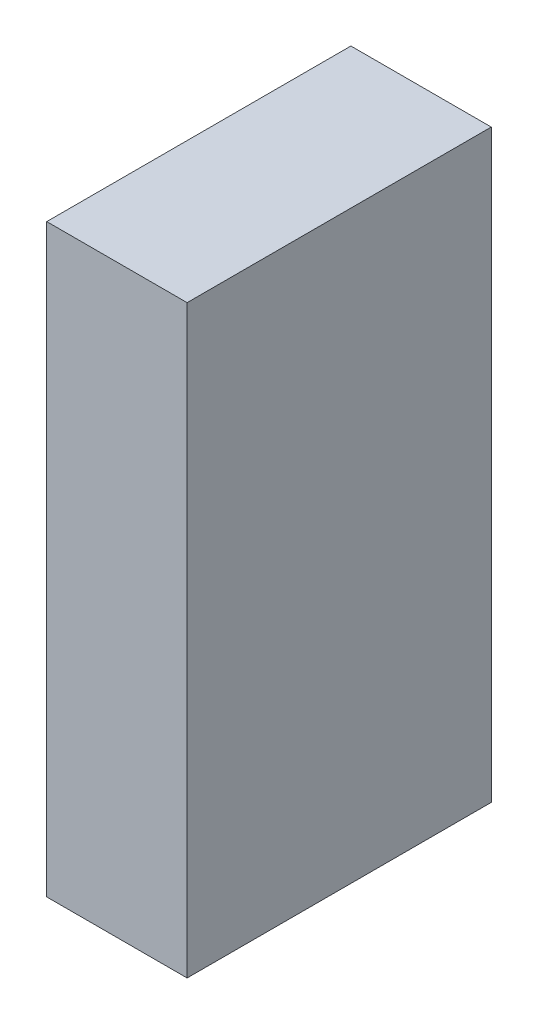
ISO-10303-21;
HEADER;
FILE_DESCRIPTION(('STEP AP214'),'2;1');
FILE_NAME('part.step','',(''),(''),'','','');
FILE_SCHEMA(('AUTOMOTIVE_DESIGN { 1 0 10303 214 1 1 1 1 }'));
ENDSEC;
DATA;
#1=APPLICATION_CONTEXT('core data for automotive mechanical design processes');
#2=APPLICATION_PROTOCOL_DEFINITION('international standard','automotive_design',2000,#1);
#3=PRODUCT_CONTEXT('',#1,'mechanical');
#4=PRODUCT('Part','Part','',(#3));
#5=PRODUCT_RELATED_PRODUCT_CATEGORY('part','',(#4));
#6=PRODUCT_DEFINITION_FORMATION('','',#4);
#7=PRODUCT_DEFINITION_CONTEXT('part definition',#1,'design');
#8=PRODUCT_DEFINITION('design','',#6,#7);
#9=PRODUCT_DEFINITION_SHAPE('','',#8);
#10=(LENGTH_UNIT() NAMED_UNIT(*) SI_UNIT(.MILLI.,.METRE.));
#11=(NAMED_UNIT(*) PLANE_ANGLE_UNIT() SI_UNIT($,.RADIAN.));
#12=(NAMED_UNIT(*) SI_UNIT($,.STERADIAN.) SOLID_ANGLE_UNIT());
#13=UNCERTAINTY_MEASURE_WITH_UNIT(LENGTH_MEASURE(1.E-05),#10,'distance_accuracy_value','');
#14=(GEOMETRIC_REPRESENTATION_CONTEXT(3) GLOBAL_UNCERTAINTY_ASSIGNED_CONTEXT((#13)) GLOBAL_UNIT_ASSIGNED_CONTEXT((#10,
#11,#12)) REPRESENTATION_CONTEXT('',''));
#15=CARTESIAN_POINT('',(0.,0.,0.));
#16=DIRECTION('',(0.,0.,1.));
#17=DIRECTION('',(1.,0.,0.));
#18=AXIS2_PLACEMENT_3D('',#15,#16,#17);
#19=CARTESIAN_POINT('',(0.3,0.,0.));
#20=DIRECTION('',(1.,0.,0.));
#21=DIRECTION('',(0.,0.,-1.));
#22=AXIS2_PLACEMENT_3D('',#19,#20,#21);
#23=PLANE('',#22);
#24=DIRECTION('',(0.,0.,1.));
#25=VECTOR('',#24,1.);
#26=CARTESIAN_POINT('',(0.3,1.25,0.));
#27=LINE('',#26,#25);
#28=CARTESIAN_POINT('',(0.3,1.25,0.65));
#29=VERTEX_POINT('',#28);
#30=CARTESIAN_POINT('',(0.3,1.25,0.));
#31=VERTEX_POINT('',#30);
#32=EDGE_CURVE('E76',#29,#31,#27,.F.);
#33=ORIENTED_EDGE('',*,*,#32,.F.);
#34=DIRECTION('',(0.,1.,0.));
#35=VECTOR('',#34,1.);
#36=CARTESIAN_POINT('',(0.3,0.,0.65));
#37=LINE('',#36,#35);
#38=CARTESIAN_POINT('',(0.3,0.,0.65));
#39=VERTEX_POINT('',#38);
#40=EDGE_CURVE('E58',#39,#29,#37,.T.);
#41=ORIENTED_EDGE('',*,*,#40,.F.);
#42=DIRECTION('',(0.,0.,1.));
#43=VECTOR('',#42,1.);
#44=CARTESIAN_POINT('',(0.3,0.,0.));
#45=LINE('',#44,#43);
#46=CARTESIAN_POINT('',(0.3,0.,0.));
#47=VERTEX_POINT('',#46);
#48=EDGE_CURVE('E20',#39,#47,#45,.F.);
#49=ORIENTED_EDGE('',*,*,#48,.T.);
#50=DIRECTION('',(0.,1.,0.));
#51=VECTOR('',#50,1.);
#52=CARTESIAN_POINT('',(0.3,0.,0.));
#53=LINE('',#52,#51);
#54=EDGE_CURVE('E55',#47,#31,#53,.T.);
#55=ORIENTED_EDGE('',*,*,#54,.T.);
#56=EDGE_LOOP('',(#33,#41,#49,#55));
#57=FACE_BOUND('',#56,.T.);
#58=ADVANCED_FACE('F17',(#57),#23,.T.);
#59=CARTESIAN_POINT('',(0.,0.,0.));
#60=DIRECTION('',(0.,1.,0.));
#61=DIRECTION('',(0.,0.,1.));
#62=AXIS2_PLACEMENT_3D('',#59,#60,#61);
#63=PLANE('',#62);
#64=DIRECTION('',(1.,0.,0.));
#65=VECTOR('',#64,1.);
#66=CARTESIAN_POINT('',(0.,0.,0.65));
#67=LINE('',#66,#65);
#68=CARTESIAN_POINT('',(0.,0.,0.65));
#69=VERTEX_POINT('',#68);
#70=EDGE_CURVE('E78',#69,#39,#67,.T.);
#71=ORIENTED_EDGE('',*,*,#70,.F.);
#72=DIRECTION('',(0.,0.,-1.));
#73=VECTOR('',#72,1.);
#74=CARTESIAN_POINT('',(0.,0.,0.));
#75=LINE('',#74,#73);
#76=CARTESIAN_POINT('',(0.,0.,0.));
#77=VERTEX_POINT('',#76);
#78=EDGE_CURVE('E73',#69,#77,#75,.T.);
#79=ORIENTED_EDGE('',*,*,#78,.T.);
#80=DIRECTION('',(1.,0.,0.));
#81=VECTOR('',#80,1.);
#82=CARTESIAN_POINT('',(0.,0.,0.));
#83=LINE('',#82,#81);
#84=EDGE_CURVE('E63',#77,#47,#83,.T.);
#85=ORIENTED_EDGE('',*,*,#84,.T.);
#86=ORIENTED_EDGE('',*,*,#48,.F.);
#87=EDGE_LOOP('',(#71,#79,#85,#86));
#88=FACE_BOUND('',#87,.T.);
#89=ADVANCED_FACE('F72',(#88),#63,.F.);
#90=CARTESIAN_POINT('',(0.,0.,0.));
#91=DIRECTION('',(0.,0.,1.));
#92=DIRECTION('',(1.,0.,0.));
#93=AXIS2_PLACEMENT_3D('',#90,#91,#92);
#94=PLANE('',#93);
#95=ORIENTED_EDGE('',*,*,#54,.F.);
#96=ORIENTED_EDGE('',*,*,#84,.F.);
#97=DIRECTION('',(0.,1.,0.));
#98=VECTOR('',#97,1.);
#99=CARTESIAN_POINT('',(0.,0.,0.));
#100=LINE('',#99,#98);
#101=CARTESIAN_POINT('',(0.,1.25,0.));
#102=VERTEX_POINT('',#101);
#103=EDGE_CURVE('E83',#77,#102,#100,.T.);
#104=ORIENTED_EDGE('',*,*,#103,.T.);
#105=DIRECTION('',(1.,0.,0.));
#106=VECTOR('',#105,1.);
#107=CARTESIAN_POINT('',(0.,1.25,0.));
#108=LINE('',#107,#106);
#109=EDGE_CURVE('E69',#31,#102,#108,.F.);
#110=ORIENTED_EDGE('',*,*,#109,.F.);
#111=EDGE_LOOP('',(#95,#96,#104,#110));
#112=FACE_BOUND('',#111,.T.);
#113=ADVANCED_FACE('F66',(#112),#94,.F.);
#114=CARTESIAN_POINT('',(0.,1.25,0.));
#115=DIRECTION('',(0.,1.,0.));
#116=DIRECTION('',(0.,0.,1.));
#117=AXIS2_PLACEMENT_3D('',#114,#115,#116);
#118=PLANE('',#117);
#119=DIRECTION('',(1.,0.,0.));
#120=VECTOR('',#119,1.);
#121=CARTESIAN_POINT('',(0.,1.25,0.65));
#122=LINE('',#121,#120);
#123=CARTESIAN_POINT('',(0.,1.25,0.65));
#124=VERTEX_POINT('',#123);
#125=EDGE_CURVE('E34',#29,#124,#122,.F.);
#126=ORIENTED_EDGE('',*,*,#125,.F.);
#127=ORIENTED_EDGE('',*,*,#32,.T.);
#128=ORIENTED_EDGE('',*,*,#109,.T.);
#129=DIRECTION('',(0.,0.,-1.));
#130=VECTOR('',#129,1.);
#131=CARTESIAN_POINT('',(0.,1.25,0.));
#132=LINE('',#131,#130);
#133=EDGE_CURVE('E26',#102,#124,#132,.F.);
#134=ORIENTED_EDGE('',*,*,#133,.T.);
#135=EDGE_LOOP('',(#126,#127,#128,#134));
#136=FACE_BOUND('',#135,.T.);
#137=ADVANCED_FACE('F88',(#136),#118,.T.);
#138=CARTESIAN_POINT('',(0.,0.,0.65));
#139=DIRECTION('',(0.,0.,1.));
#140=DIRECTION('',(1.,0.,0.));
#141=AXIS2_PLACEMENT_3D('',#138,#139,#140);
#142=PLANE('',#141);
#143=ORIENTED_EDGE('',*,*,#40,.T.);
#144=ORIENTED_EDGE('',*,*,#125,.T.);
#145=DIRECTION('',(0.,1.,0.));
#146=VECTOR('',#145,1.);
#147=CARTESIAN_POINT('',(0.,0.,0.65));
#148=LINE('',#147,#146);
#149=EDGE_CURVE('E11',#124,#69,#148,.F.);
#150=ORIENTED_EDGE('',*,*,#149,.T.);
#151=ORIENTED_EDGE('',*,*,#70,.T.);
#152=EDGE_LOOP('',(#143,#144,#150,#151));
#153=FACE_BOUND('',#152,.T.);
#154=ADVANCED_FACE('F91',(#153),#142,.T.);
#155=CARTESIAN_POINT('',(0.,0.,0.));
#156=DIRECTION('',(1.,0.,0.));
#157=DIRECTION('',(0.,0.,-1.));
#158=AXIS2_PLACEMENT_3D('',#155,#156,#157);
#159=PLANE('',#158);
#160=ORIENTED_EDGE('',*,*,#133,.F.);
#161=ORIENTED_EDGE('',*,*,#103,.F.);
#162=ORIENTED_EDGE('',*,*,#78,.F.);
#163=ORIENTED_EDGE('',*,*,#149,.F.);
#164=EDGE_LOOP('',(#160,#161,#162,#163));
#165=FACE_BOUND('',#164,.T.);
#166=ADVANCED_FACE('F90',(#165),#159,.F.);
#167=CLOSED_SHELL('',(#58,#89,#113,#137,#154,#166));
#168=MANIFOLD_SOLID_BREP('B1',#167);
#169=ADVANCED_BREP_SHAPE_REPRESENTATION('',(#18,#168),#14);
#170=SHAPE_DEFINITION_REPRESENTATION(#9,#169);
ENDSEC;
END-ISO-10303-21;
